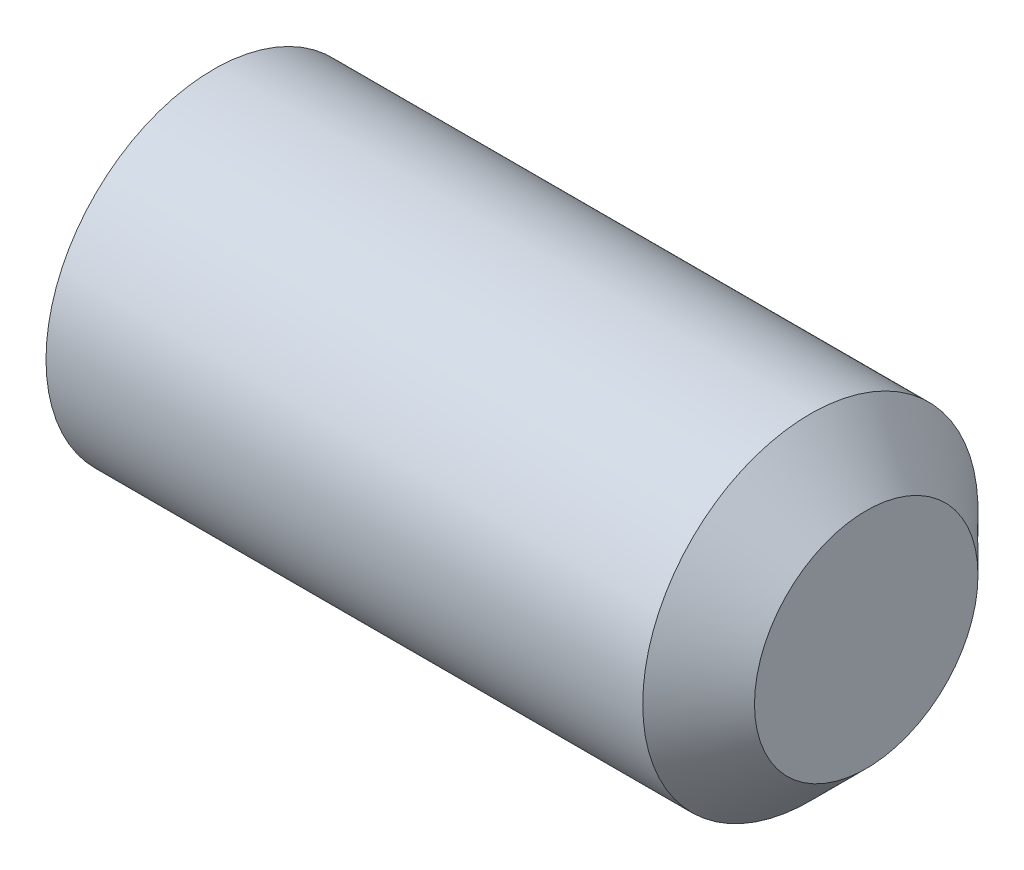
ISO-10303-21;
HEADER;
FILE_DESCRIPTION(('STEP AP214'),'2;1');
FILE_NAME('part.step','',(''),(''),'','','');
FILE_SCHEMA(('AUTOMOTIVE_DESIGN { 1 0 10303 214 1 1 1 1 }'));
ENDSEC;
DATA;
#1=APPLICATION_CONTEXT('core data for automotive mechanical design processes');
#2=APPLICATION_PROTOCOL_DEFINITION('international standard','automotive_design',2000,#1);
#3=PRODUCT_CONTEXT('',#1,'mechanical');
#4=PRODUCT('Part','Part','',(#3));
#5=PRODUCT_RELATED_PRODUCT_CATEGORY('part','',(#4));
#6=PRODUCT_DEFINITION_FORMATION('','',#4);
#7=PRODUCT_DEFINITION_CONTEXT('part definition',#1,'design');
#8=PRODUCT_DEFINITION('design','',#6,#7);
#9=PRODUCT_DEFINITION_SHAPE('','',#8);
#10=(LENGTH_UNIT() NAMED_UNIT(*) SI_UNIT(.MILLI.,.METRE.));
#11=(NAMED_UNIT(*) PLANE_ANGLE_UNIT() SI_UNIT($,.RADIAN.));
#12=(NAMED_UNIT(*) SI_UNIT($,.STERADIAN.) SOLID_ANGLE_UNIT());
#13=UNCERTAINTY_MEASURE_WITH_UNIT(LENGTH_MEASURE(1.E-05),#10,'distance_accuracy_value','');
#14=(GEOMETRIC_REPRESENTATION_CONTEXT(3) GLOBAL_UNCERTAINTY_ASSIGNED_CONTEXT((#13)) GLOBAL_UNIT_ASSIGNED_CONTEXT((#10,
#11,#12)) REPRESENTATION_CONTEXT('',''));
#15=CARTESIAN_POINT('',(0.,0.,0.));
#16=DIRECTION('',(0.,0.,1.));
#17=DIRECTION('',(1.,0.,0.));
#18=AXIS2_PLACEMENT_3D('',#15,#16,#17);
#19=CARTESIAN_POINT('',(0.,0.,0.));
#20=DIRECTION('',(-1.,0.,0.));
#21=DIRECTION('',(0.,0.,1.));
#22=AXIS2_PLACEMENT_3D('',#19,#20,#21);
#23=PLANE('',#22);
#24=CARTESIAN_POINT('',(0.,0.,0.));
#25=DIRECTION('',(-1.,0.,0.));
#26=DIRECTION('',(0.,0.,1.));
#27=AXIS2_PLACEMENT_3D('',#24,#25,#26);
#28=CIRCLE('',#27,2.4455);
#29=CARTESIAN_POINT('',(0.,0.,2.44550000000001));
#30=VERTEX_POINT('',#29);
#31=EDGE_CURVE('E168',#30,#30,#28,.T.);
#32=ORIENTED_EDGE('',*,*,#31,.T.);
#33=EDGE_LOOP('',(#32));
#34=FACE_BOUND('',#33,.T.);
#35=DIRECTION('',(0.,0.,-1.));
#36=VECTOR('',#35,1.);
#37=CARTESIAN_POINT('',(0.,1.50000000000001,0.866025403784444));
#38=LINE('',#37,#36);
#39=CARTESIAN_POINT('',(0.,1.50000000000001,0.866025403784444));
#40=VERTEX_POINT('',#39);
#41=CARTESIAN_POINT('',(0.,1.50000000000002,-0.866025403784449));
#42=VERTEX_POINT('',#41);
#43=EDGE_CURVE('E153',#40,#42,#38,.T.);
#44=ORIENTED_EDGE('',*,*,#43,.F.);
#45=DIRECTION('',(0.,-0.866025403784444,0.5));
#46=VECTOR('',#45,1.);
#47=CARTESIAN_POINT('',(0.,1.50000000000001,0.866025403784444));
#48=LINE('',#47,#46);
#49=CARTESIAN_POINT('',(0.,0.,1.73205080756889));
#50=VERTEX_POINT('',#49);
#51=EDGE_CURVE('E65',#40,#50,#48,.T.);
#52=ORIENTED_EDGE('',*,*,#51,.T.);
#53=DIRECTION('',(0.,0.866025403784448,0.500000000000004));
#54=VECTOR('',#53,1.);
#55=CARTESIAN_POINT('',(0.,-1.50000000000001,0.866025403784445));
#56=LINE('',#55,#54);
#57=CARTESIAN_POINT('',(0.,-1.50000000000001,0.866025403784445));
#58=VERTEX_POINT('',#57);
#59=EDGE_CURVE('E140',#58,#50,#56,.T.);
#60=ORIENTED_EDGE('',*,*,#59,.F.);
#61=DIRECTION('',(0.,0.,-1.));
#62=VECTOR('',#61,1.);
#63=CARTESIAN_POINT('',(0.,-1.50000000000001,0.866025403784445));
#64=LINE('',#63,#62);
#65=CARTESIAN_POINT('',(0.,-1.50000000000001,-0.866025403784447));
#66=VERTEX_POINT('',#65);
#67=EDGE_CURVE('E144',#58,#66,#64,.T.);
#68=ORIENTED_EDGE('',*,*,#67,.T.);
#69=DIRECTION('',(0.,0.866025403784444,-0.5));
#70=VECTOR('',#69,1.);
#71=CARTESIAN_POINT('',(0.,-1.50000000000001,-0.866025403784447));
#72=LINE('',#71,#70);
#73=CARTESIAN_POINT('',(0.,0.,-1.7320508075689));
#74=VERTEX_POINT('',#73);
#75=EDGE_CURVE('E148',#66,#74,#72,.T.);
#76=ORIENTED_EDGE('',*,*,#75,.T.);
#77=DIRECTION('',(0.,-0.866025403784448,-0.500000000000004));
#78=VECTOR('',#77,1.);
#79=CARTESIAN_POINT('',(0.,1.50000000000002,-0.866025403784449));
#80=LINE('',#79,#78);
#81=EDGE_CURVE('E124',#42,#74,#80,.T.);
#82=ORIENTED_EDGE('',*,*,#81,.F.);
#83=EDGE_LOOP('',(#44,#52,#60,#68,#76,#82));
#84=FACE_BOUND('',#83,.T.);
#85=ADVANCED_FACE('F49',(#34,#84),#23,.T.);
#86=CARTESIAN_POINT('',(12.,2.,0.));
#87=DIRECTION('',(1.,0.,0.));
#88=DIRECTION('',(0.,0.,-1.));
#89=AXIS2_PLACEMENT_3D('',#86,#87,#88);
#90=PLANE('',#89);
#91=CARTESIAN_POINT('',(12.,0.,0.));
#92=DIRECTION('',(-1.,0.,0.));
#93=DIRECTION('',(0.,0.,1.));
#94=AXIS2_PLACEMENT_3D('',#91,#92,#93);
#95=CIRCLE('',#94,2.);
#96=CARTESIAN_POINT('',(12.,0.,2.00000000000001));
#97=VERTEX_POINT('',#96);
#98=EDGE_CURVE('E11',#97,#97,#95,.T.);
#99=ORIENTED_EDGE('',*,*,#98,.F.);
#100=EDGE_LOOP('',(#99));
#101=FACE_BOUND('',#100,.T.);
#102=ADVANCED_FACE('F51',(#101),#90,.T.);
#103=CARTESIAN_POINT('',(11.,0.,0.));
#104=DIRECTION('',(-1.,0.,0.));
#105=DIRECTION('',(0.,0.,1.));
#106=AXIS2_PLACEMENT_3D('',#103,#104,#105);
#107=CONICAL_SURFACE('',#106,3.,0.785398163397446);
#108=ORIENTED_EDGE('',*,*,#98,.T.);
#109=EDGE_LOOP('',(#108));
#110=FACE_BOUND('',#109,.T.);
#111=CARTESIAN_POINT('',(11.,0.,0.));
#112=DIRECTION('',(-1.,0.,0.));
#113=DIRECTION('',(0.,0.,1.));
#114=AXIS2_PLACEMENT_3D('',#111,#112,#113);
#115=CIRCLE('',#114,3.);
#116=CARTESIAN_POINT('',(11.,0.,3.00000000000001));
#117=VERTEX_POINT('',#116);
#118=EDGE_CURVE('E58',#117,#117,#115,.T.);
#119=ORIENTED_EDGE('',*,*,#118,.F.);
#120=EDGE_LOOP('',(#119));
#121=FACE_BOUND('',#120,.T.);
#122=ADVANCED_FACE('F183',(#110,#121),#107,.T.);
#123=CARTESIAN_POINT('',(-12.7,0.,0.));
#124=DIRECTION('',(-1.,0.,0.));
#125=DIRECTION('',(0.,0.,1.));
#126=AXIS2_PLACEMENT_3D('',#123,#124,#125);
#127=CYLINDRICAL_SURFACE('',#126,3.);
#128=ORIENTED_EDGE('',*,*,#118,.T.);
#129=EDGE_LOOP('',(#128));
#130=FACE_BOUND('',#129,.T.);
#131=CARTESIAN_POINT('',(0.320140724265644,0.,0.));
#132=DIRECTION('',(-1.,0.,0.));
#133=DIRECTION('',(0.,0.,1.));
#134=AXIS2_PLACEMENT_3D('',#131,#132,#133);
#135=CIRCLE('',#134,3.);
#136=CARTESIAN_POINT('',(0.320140724265644,0.,3.00000000000001));
#137=VERTEX_POINT('',#136);
#138=EDGE_CURVE('E172',#137,#137,#135,.T.);
#139=ORIENTED_EDGE('',*,*,#138,.F.);
#140=EDGE_LOOP('',(#139));
#141=FACE_BOUND('',#140,.T.);
#142=ADVANCED_FACE('F180',(#130,#141),#127,.T.);
#143=CARTESIAN_POINT('',(0.,0.,0.));
#144=DIRECTION('',(1.,0.,0.));
#145=DIRECTION('',(0.,0.,-1.));
#146=AXIS2_PLACEMENT_3D('',#143,#144,#145);
#147=CONICAL_SURFACE('',#146,2.4455,1.0471975511966);
#148=ORIENTED_EDGE('',*,*,#138,.T.);
#149=EDGE_LOOP('',(#148));
#150=FACE_BOUND('',#149,.T.);
#151=ORIENTED_EDGE('',*,*,#31,.F.);
#152=EDGE_LOOP('',(#151));
#153=FACE_BOUND('',#152,.T.);
#154=ADVANCED_FACE('F190',(#150,#153),#147,.T.);
#155=CARTESIAN_POINT('',(3.5,1.50000000000001,0.866025403784444));
#156=DIRECTION('',(0.,-0.5,-0.866025403784444));
#157=DIRECTION('',(0.,0.866025403784444,-0.5));
#158=AXIS2_PLACEMENT_3D('',#155,#156,#157);
#159=PLANE('',#158);
#160=ORIENTED_EDGE('',*,*,#51,.F.);
#161=DIRECTION('',(-1.,0.,0.));
#162=VECTOR('',#161,1.);
#163=CARTESIAN_POINT('',(3.5,1.50000000000001,0.866025403784444));
#164=LINE('',#163,#162);
#165=CARTESIAN_POINT('',(3.5,1.50000000000001,0.866025403784444));
#166=VERTEX_POINT('',#165);
#167=EDGE_CURVE('E70',#166,#40,#164,.T.);
#168=ORIENTED_EDGE('',*,*,#167,.F.);
#169=DIRECTION('',(0.,-0.866025403784444,0.5));
#170=VECTOR('',#169,1.);
#171=CARTESIAN_POINT('',(3.5,1.50000000000001,0.866025403784444));
#172=LINE('',#171,#170);
#173=CARTESIAN_POINT('',(3.5,0.,1.73205080756889));
#174=VERTEX_POINT('',#173);
#175=EDGE_CURVE('E97',#166,#174,#172,.T.);
#176=ORIENTED_EDGE('',*,*,#175,.T.);
#177=DIRECTION('',(-1.,0.,0.));
#178=VECTOR('',#177,1.);
#179=CARTESIAN_POINT('',(3.5,0.,1.73205080756889));
#180=LINE('',#179,#178);
#181=EDGE_CURVE('E165',#174,#50,#180,.T.);
#182=ORIENTED_EDGE('',*,*,#181,.T.);
#183=EDGE_LOOP('',(#160,#168,#176,#182));
#184=FACE_BOUND('',#183,.T.);
#185=ADVANCED_FACE('F201',(#184),#159,.T.);
#186=CARTESIAN_POINT('',(3.5,-1.50000000000001,0.866025403784445));
#187=DIRECTION('',(0.,-0.500000000000004,0.866025403784448));
#188=DIRECTION('',(0.,-0.866025403784448,-0.500000000000004));
#189=AXIS2_PLACEMENT_3D('',#186,#187,#188);
#190=PLANE('',#189);
#191=ORIENTED_EDGE('',*,*,#59,.T.);
#192=ORIENTED_EDGE('',*,*,#181,.F.);
#193=DIRECTION('',(0.,0.866025403784448,0.500000000000004));
#194=VECTOR('',#193,1.);
#195=CARTESIAN_POINT('',(3.5,-1.50000000000001,0.866025403784445));
#196=LINE('',#195,#194);
#197=CARTESIAN_POINT('',(3.5,-1.50000000000001,0.866025403784445));
#198=VERTEX_POINT('',#197);
#199=EDGE_CURVE('E350',#198,#174,#196,.T.);
#200=ORIENTED_EDGE('',*,*,#199,.F.);
#201=DIRECTION('',(-1.,0.,0.));
#202=VECTOR('',#201,1.);
#203=CARTESIAN_POINT('',(3.5,-1.50000000000001,0.866025403784445));
#204=LINE('',#203,#202);
#205=EDGE_CURVE('E162',#198,#58,#204,.T.);
#206=ORIENTED_EDGE('',*,*,#205,.T.);
#207=EDGE_LOOP('',(#191,#192,#200,#206));
#208=FACE_BOUND('',#207,.T.);
#209=ADVANCED_FACE('F208',(#208),#190,.F.);
#210=CARTESIAN_POINT('',(3.5,-1.50000000000001,0.866025403784445));
#211=DIRECTION('',(0.,1.,0.));
#212=DIRECTION('',(0.,0.,1.));
#213=AXIS2_PLACEMENT_3D('',#210,#211,#212);
#214=PLANE('',#213);
#215=ORIENTED_EDGE('',*,*,#67,.F.);
#216=ORIENTED_EDGE('',*,*,#205,.F.);
#217=DIRECTION('',(0.,0.,-1.));
#218=VECTOR('',#217,1.);
#219=CARTESIAN_POINT('',(3.5,-1.50000000000001,0.866025403784445));
#220=LINE('',#219,#218);
#221=CARTESIAN_POINT('',(3.5,-1.50000000000001,-0.866025403784447));
#222=VERTEX_POINT('',#221);
#223=EDGE_CURVE('E119',#198,#222,#220,.T.);
#224=ORIENTED_EDGE('',*,*,#223,.T.);
#225=DIRECTION('',(-1.,0.,0.));
#226=VECTOR('',#225,1.);
#227=CARTESIAN_POINT('',(3.5,-1.50000000000001,-0.866025403784447));
#228=LINE('',#227,#226);
#229=EDGE_CURVE('E113',#222,#66,#228,.T.);
#230=ORIENTED_EDGE('',*,*,#229,.T.);
#231=EDGE_LOOP('',(#215,#216,#224,#230));
#232=FACE_BOUND('',#231,.T.);
#233=ADVANCED_FACE('F215',(#232),#214,.T.);
#234=CARTESIAN_POINT('',(3.5,-1.50000000000001,-0.866025403784447));
#235=DIRECTION('',(0.,0.5,0.866025403784444));
#236=DIRECTION('',(0.,-0.866025403784444,0.5));
#237=AXIS2_PLACEMENT_3D('',#234,#235,#236);
#238=PLANE('',#237);
#239=ORIENTED_EDGE('',*,*,#75,.F.);
#240=ORIENTED_EDGE('',*,*,#229,.F.);
#241=DIRECTION('',(0.,0.866025403784444,-0.5));
#242=VECTOR('',#241,1.);
#243=CARTESIAN_POINT('',(3.5,-1.50000000000001,-0.866025403784447));
#244=LINE('',#243,#242);
#245=CARTESIAN_POINT('',(3.5,0.,-1.7320508075689));
#246=VERTEX_POINT('',#245);
#247=EDGE_CURVE('E108',#222,#246,#244,.T.);
#248=ORIENTED_EDGE('',*,*,#247,.T.);
#249=DIRECTION('',(-1.,0.,0.));
#250=VECTOR('',#249,1.);
#251=CARTESIAN_POINT('',(3.5,0.,-1.7320508075689));
#252=LINE('',#251,#250);
#253=EDGE_CURVE('E112',#246,#74,#252,.T.);
#254=ORIENTED_EDGE('',*,*,#253,.T.);
#255=EDGE_LOOP('',(#239,#240,#248,#254));
#256=FACE_BOUND('',#255,.T.);
#257=ADVANCED_FACE('F111',(#256),#238,.T.);
#258=CARTESIAN_POINT('',(3.5,1.50000000000002,-0.866025403784449));
#259=DIRECTION('',(0.,0.500000000000004,-0.866025403784448));
#260=DIRECTION('',(0.,0.866025403784448,0.500000000000004));
#261=AXIS2_PLACEMENT_3D('',#258,#259,#260);
#262=PLANE('',#261);
#263=ORIENTED_EDGE('',*,*,#81,.T.);
#264=ORIENTED_EDGE('',*,*,#253,.F.);
#265=DIRECTION('',(0.,-0.866025403784448,-0.500000000000004));
#266=VECTOR('',#265,1.);
#267=CARTESIAN_POINT('',(3.5,1.50000000000002,-0.866025403784449));
#268=LINE('',#267,#266);
#269=CARTESIAN_POINT('',(3.5,1.50000000000002,-0.866025403784449));
#270=VERTEX_POINT('',#269);
#271=EDGE_CURVE('E118',#270,#246,#268,.T.);
#272=ORIENTED_EDGE('',*,*,#271,.F.);
#273=DIRECTION('',(-1.,0.,0.));
#274=VECTOR('',#273,1.);
#275=CARTESIAN_POINT('',(3.5,1.50000000000002,-0.866025403784449));
#276=LINE('',#275,#274);
#277=EDGE_CURVE('E93',#270,#42,#276,.T.);
#278=ORIENTED_EDGE('',*,*,#277,.T.);
#279=EDGE_LOOP('',(#263,#264,#272,#278));
#280=FACE_BOUND('',#279,.T.);
#281=ADVANCED_FACE('F121',(#280),#262,.F.);
#282=CARTESIAN_POINT('',(3.5,1.50000000000001,0.866025403784444));
#283=DIRECTION('',(0.,1.,0.));
#284=DIRECTION('',(0.,0.,1.));
#285=AXIS2_PLACEMENT_3D('',#282,#283,#284);
#286=PLANE('',#285);
#287=ORIENTED_EDGE('',*,*,#43,.T.);
#288=ORIENTED_EDGE('',*,*,#277,.F.);
#289=DIRECTION('',(0.,0.,-1.));
#290=VECTOR('',#289,1.);
#291=CARTESIAN_POINT('',(3.5,1.50000000000001,0.866025403784444));
#292=LINE('',#291,#290);
#293=EDGE_CURVE('E130',#166,#270,#292,.T.);
#294=ORIENTED_EDGE('',*,*,#293,.F.);
#295=ORIENTED_EDGE('',*,*,#167,.T.);
#296=EDGE_LOOP('',(#287,#288,#294,#295));
#297=FACE_BOUND('',#296,.T.);
#298=ADVANCED_FACE('F227',(#297),#286,.F.);
#299=CARTESIAN_POINT('',(3.5,-1.50000000000001,2.59807621135334));
#300=DIRECTION('',(1.,0.,0.));
#301=DIRECTION('',(0.,0.,-1.));
#302=AXIS2_PLACEMENT_3D('',#299,#300,#301);
#303=PLANE('',#302);
#304=ORIENTED_EDGE('',*,*,#175,.F.);
#305=ORIENTED_EDGE('',*,*,#293,.T.);
#306=ORIENTED_EDGE('',*,*,#271,.T.);
#307=ORIENTED_EDGE('',*,*,#247,.F.);
#308=ORIENTED_EDGE('',*,*,#223,.F.);
#309=ORIENTED_EDGE('',*,*,#199,.T.);
#310=EDGE_LOOP('',(#304,#305,#306,#307,#308,#309));
#311=FACE_BOUND('',#310,.T.);
#312=ADVANCED_FACE('F128',(#311),#303,.F.);
#313=CLOSED_SHELL('',(#85,#102,#122,#142,#154,#185,#209,#233,#257,#281,#298,#312));
#314=MANIFOLD_SOLID_BREP('B2',#313);
#315=ADVANCED_BREP_SHAPE_REPRESENTATION('',(#18,#314),#14);
#316=SHAPE_DEFINITION_REPRESENTATION(#9,#315);
ENDSEC;
END-ISO-10303-21;
